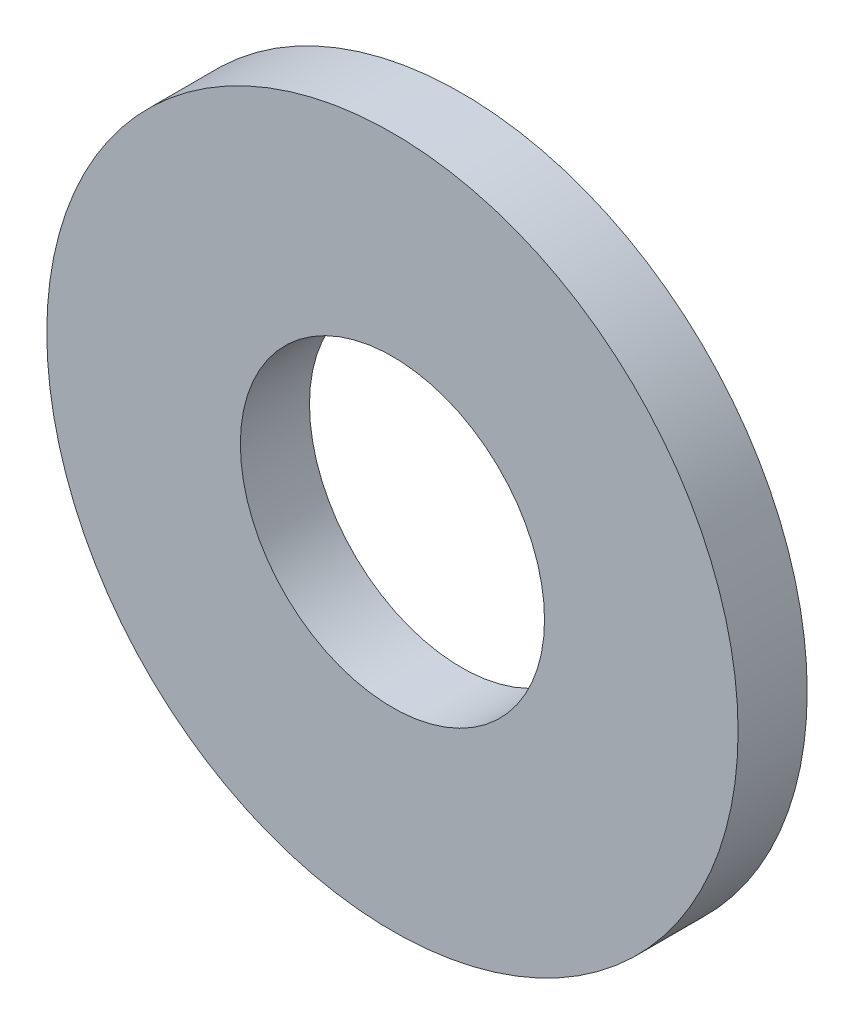
ISO-10303-21;
HEADER;
FILE_DESCRIPTION(('STEP AP214'),'2;1');
FILE_NAME('part.step','',(''),(''),'','','');
FILE_SCHEMA(('AUTOMOTIVE_DESIGN { 1 0 10303 214 1 1 1 1 }'));
ENDSEC;
DATA;
#1=APPLICATION_CONTEXT('core data for automotive mechanical design processes');
#2=APPLICATION_PROTOCOL_DEFINITION('international standard','automotive_design',2000,#1);
#3=PRODUCT_CONTEXT('',#1,'mechanical');
#4=PRODUCT('Part','Part','',(#3));
#5=PRODUCT_RELATED_PRODUCT_CATEGORY('part','',(#4));
#6=PRODUCT_DEFINITION_FORMATION('','',#4);
#7=PRODUCT_DEFINITION_CONTEXT('part definition',#1,'design');
#8=PRODUCT_DEFINITION('design','',#6,#7);
#9=PRODUCT_DEFINITION_SHAPE('','',#8);
#10=(LENGTH_UNIT() NAMED_UNIT(*) SI_UNIT(.MILLI.,.METRE.));
#11=(NAMED_UNIT(*) PLANE_ANGLE_UNIT() SI_UNIT($,.RADIAN.));
#12=(NAMED_UNIT(*) SI_UNIT($,.STERADIAN.) SOLID_ANGLE_UNIT());
#13=UNCERTAINTY_MEASURE_WITH_UNIT(LENGTH_MEASURE(1.E-05),#10,'distance_accuracy_value','');
#14=(GEOMETRIC_REPRESENTATION_CONTEXT(3) GLOBAL_UNCERTAINTY_ASSIGNED_CONTEXT((#13)) GLOBAL_UNIT_ASSIGNED_CONTEXT((#10,
#11,#12)) REPRESENTATION_CONTEXT('',''));
#15=CARTESIAN_POINT('',(0.,0.,0.));
#16=DIRECTION('',(0.,0.,1.));
#17=DIRECTION('',(1.,0.,0.));
#18=AXIS2_PLACEMENT_3D('',#15,#16,#17);
#19=CARTESIAN_POINT('',(0.,0.,0.5));
#20=DIRECTION('',(0.,0.,1.));
#21=DIRECTION('',(1.,0.,0.));
#22=AXIS2_PLACEMENT_3D('',#19,#20,#21);
#23=PLANE('',#22);
#24=CARTESIAN_POINT('',(0.,0.,0.5));
#25=DIRECTION('',(0.,0.,1.));
#26=DIRECTION('',(1.,0.,0.));
#27=AXIS2_PLACEMENT_3D('',#24,#25,#26);
#28=CIRCLE('',#27,2.5);
#29=CARTESIAN_POINT('',(2.5,0.,0.5));
#30=VERTEX_POINT('',#29);
#31=EDGE_CURVE('E10',#30,#30,#28,.T.);
#32=ORIENTED_EDGE('',*,*,#31,.T.);
#33=EDGE_LOOP('',(#32));
#34=FACE_BOUND('',#33,.T.);
#35=CARTESIAN_POINT('',(0.,0.,0.5));
#36=DIRECTION('',(0.,0.,1.));
#37=DIRECTION('',(1.,0.,0.));
#38=AXIS2_PLACEMENT_3D('',#35,#36,#37);
#39=CIRCLE('',#38,1.1);
#40=CARTESIAN_POINT('',(1.1,0.,0.5));
#41=VERTEX_POINT('',#40);
#42=EDGE_CURVE('E55',#41,#41,#39,.T.);
#43=ORIENTED_EDGE('',*,*,#42,.F.);
#44=EDGE_LOOP('',(#43));
#45=FACE_BOUND('',#44,.T.);
#46=ADVANCED_FACE('F41',(#34,#45),#23,.T.);
#47=CARTESIAN_POINT('',(0.,0.,0.));
#48=DIRECTION('',(0.,0.,1.));
#49=DIRECTION('',(1.,0.,0.));
#50=AXIS2_PLACEMENT_3D('',#47,#48,#49);
#51=PLANE('',#50);
#52=CARTESIAN_POINT('',(0.,0.,0.));
#53=DIRECTION('',(0.,0.,1.));
#54=DIRECTION('',(1.,0.,0.));
#55=AXIS2_PLACEMENT_3D('',#52,#53,#54);
#56=CIRCLE('',#55,2.5);
#57=CARTESIAN_POINT('',(2.5,0.,0.));
#58=VERTEX_POINT('',#57);
#59=EDGE_CURVE('E44',#58,#58,#56,.T.);
#60=ORIENTED_EDGE('',*,*,#59,.F.);
#61=EDGE_LOOP('',(#60));
#62=FACE_BOUND('',#61,.T.);
#63=CARTESIAN_POINT('',(0.,0.,0.));
#64=DIRECTION('',(0.,0.,1.));
#65=DIRECTION('',(1.,0.,0.));
#66=AXIS2_PLACEMENT_3D('',#63,#64,#65);
#67=CIRCLE('',#66,1.1);
#68=CARTESIAN_POINT('',(1.1,0.,0.));
#69=VERTEX_POINT('',#68);
#70=EDGE_CURVE('E53',#69,#69,#67,.T.);
#71=ORIENTED_EDGE('',*,*,#70,.T.);
#72=EDGE_LOOP('',(#71));
#73=FACE_BOUND('',#72,.T.);
#74=ADVANCED_FACE('F63',(#62,#73),#51,.F.);
#75=CARTESIAN_POINT('',(0.,0.,0.5));
#76=DIRECTION('',(0.,0.,-1.));
#77=DIRECTION('',(-1.,0.,0.));
#78=AXIS2_PLACEMENT_3D('',#75,#76,#77);
#79=CYLINDRICAL_SURFACE('',#78,2.5);
#80=ORIENTED_EDGE('',*,*,#31,.F.);
#81=EDGE_LOOP('',(#80));
#82=FACE_BOUND('',#81,.T.);
#83=ORIENTED_EDGE('',*,*,#59,.T.);
#84=EDGE_LOOP('',(#83));
#85=FACE_BOUND('',#84,.T.);
#86=ADVANCED_FACE('F43',(#82,#85),#79,.T.);
#87=CARTESIAN_POINT('',(0.,0.,0.5));
#88=DIRECTION('',(0.,0.,-1.));
#89=DIRECTION('',(-1.,0.,0.));
#90=AXIS2_PLACEMENT_3D('',#87,#88,#89);
#91=CYLINDRICAL_SURFACE('',#90,1.1);
#92=ORIENTED_EDGE('',*,*,#42,.T.);
#93=EDGE_LOOP('',(#92));
#94=FACE_BOUND('',#93,.T.);
#95=ORIENTED_EDGE('',*,*,#70,.F.);
#96=EDGE_LOOP('',(#95));
#97=FACE_BOUND('',#96,.T.);
#98=ADVANCED_FACE('F58',(#94,#97),#91,.F.);
#99=CLOSED_SHELL('',(#46,#74,#86,#98));
#100=MANIFOLD_SOLID_BREP('B2',#99);
#101=ADVANCED_BREP_SHAPE_REPRESENTATION('',(#18,#100),#14);
#102=SHAPE_DEFINITION_REPRESENTATION(#9,#101);
ENDSEC;
END-ISO-10303-21;
